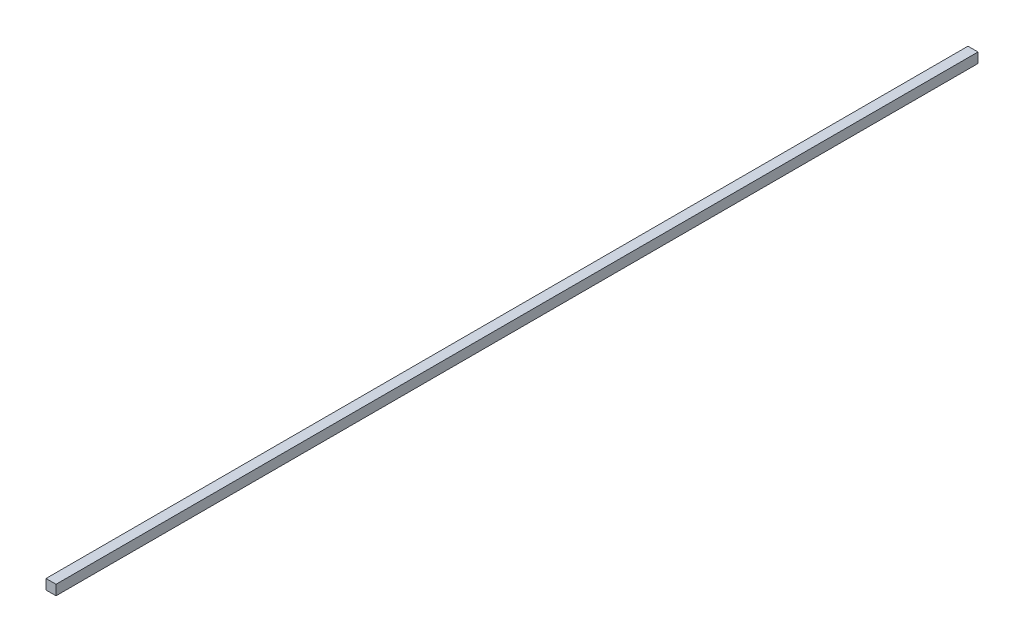
ISO-10303-21;
HEADER;
FILE_DESCRIPTION(('STEP AP214'),'2;1');
FILE_NAME('part.step','',(''),(''),'','','');
FILE_SCHEMA(('AUTOMOTIVE_DESIGN { 1 0 10303 214 1 1 1 1 }'));
ENDSEC;
DATA;
#1=APPLICATION_CONTEXT('core data for automotive mechanical design processes');
#2=APPLICATION_PROTOCOL_DEFINITION('international standard','automotive_design',2000,#1);
#3=PRODUCT_CONTEXT('',#1,'mechanical');
#4=PRODUCT('Part','Part','',(#3));
#5=PRODUCT_RELATED_PRODUCT_CATEGORY('part','',(#4));
#6=PRODUCT_DEFINITION_FORMATION('','',#4);
#7=PRODUCT_DEFINITION_CONTEXT('part definition',#1,'design');
#8=PRODUCT_DEFINITION('design','',#6,#7);
#9=PRODUCT_DEFINITION_SHAPE('','',#8);
#10=(LENGTH_UNIT() NAMED_UNIT(*) SI_UNIT(.MILLI.,.METRE.));
#11=(NAMED_UNIT(*) PLANE_ANGLE_UNIT() SI_UNIT($,.RADIAN.));
#12=(NAMED_UNIT(*) SI_UNIT($,.STERADIAN.) SOLID_ANGLE_UNIT());
#13=UNCERTAINTY_MEASURE_WITH_UNIT(LENGTH_MEASURE(1.E-05),#10,'distance_accuracy_value','');
#14=(GEOMETRIC_REPRESENTATION_CONTEXT(3) GLOBAL_UNCERTAINTY_ASSIGNED_CONTEXT((#13)) GLOBAL_UNIT_ASSIGNED_CONTEXT((#10,
#11,#12)) REPRESENTATION_CONTEXT('',''));
#15=CARTESIAN_POINT('',(0.,0.,0.));
#16=DIRECTION('',(0.,0.,1.));
#17=DIRECTION('',(1.,0.,0.));
#18=AXIS2_PLACEMENT_3D('',#15,#16,#17);
#19=CARTESIAN_POINT('',(12.7,12.7,-2336.8));
#20=DIRECTION('',(1.,0.,0.));
#21=DIRECTION('',(0.,1.,0.));
#22=AXIS2_PLACEMENT_3D('',#19,#20,#21);
#23=PLANE('',#22);
#24=DIRECTION('',(0.,1.,0.));
#25=VECTOR('',#24,1.);
#26=CARTESIAN_POINT('',(12.7,12.7,0.));
#27=LINE('',#26,#25);
#28=CARTESIAN_POINT('',(12.7,-12.7,0.));
#29=VERTEX_POINT('',#28);
#30=CARTESIAN_POINT('',(12.7,12.7,0.));
#31=VERTEX_POINT('',#30);
#32=EDGE_CURVE('E107',#29,#31,#27,.T.);
#33=ORIENTED_EDGE('',*,*,#32,.F.);
#34=DIRECTION('',(0.,0.,1.));
#35=VECTOR('',#34,1.);
#36=CARTESIAN_POINT('',(12.7,-12.7,-2336.8));
#37=LINE('',#36,#35);
#38=CARTESIAN_POINT('',(12.7,-12.7,-2336.8));
#39=VERTEX_POINT('',#38);
#40=EDGE_CURVE('E11',#39,#29,#37,.T.);
#41=ORIENTED_EDGE('',*,*,#40,.F.);
#42=DIRECTION('',(0.,1.,0.));
#43=VECTOR('',#42,1.);
#44=CARTESIAN_POINT('',(12.7,12.7,-2336.8));
#45=LINE('',#44,#43);
#46=CARTESIAN_POINT('',(12.7,12.7,-2336.8));
#47=VERTEX_POINT('',#46);
#48=EDGE_CURVE('E101',#39,#47,#45,.T.);
#49=ORIENTED_EDGE('',*,*,#48,.T.);
#50=DIRECTION('',(0.,0.,1.));
#51=VECTOR('',#50,1.);
#52=CARTESIAN_POINT('',(12.7,12.7,-2336.8));
#53=LINE('',#52,#51);
#54=EDGE_CURVE('E46',#47,#31,#53,.T.);
#55=ORIENTED_EDGE('',*,*,#54,.T.);
#56=EDGE_LOOP('',(#33,#41,#49,#55));
#57=FACE_BOUND('',#56,.T.);
#58=ADVANCED_FACE('F43',(#57),#23,.T.);
#59=CARTESIAN_POINT('',(-12.7,-12.7,-2336.8));
#60=DIRECTION('',(0.,-1.,0.));
#61=DIRECTION('',(0.,0.,-1.));
#62=AXIS2_PLACEMENT_3D('',#59,#60,#61);
#63=PLANE('',#62);
#64=DIRECTION('',(1.,0.,0.));
#65=VECTOR('',#64,1.);
#66=CARTESIAN_POINT('',(-12.7,-12.7,0.));
#67=LINE('',#66,#65);
#68=CARTESIAN_POINT('',(-12.7,-12.7,0.));
#69=VERTEX_POINT('',#68);
#70=EDGE_CURVE('E103',#69,#29,#67,.T.);
#71=ORIENTED_EDGE('',*,*,#70,.F.);
#72=DIRECTION('',(0.,0.,1.));
#73=VECTOR('',#72,1.);
#74=CARTESIAN_POINT('',(-12.7,-12.7,-2336.8));
#75=LINE('',#74,#73);
#76=CARTESIAN_POINT('',(-12.7,-12.7,-2336.8));
#77=VERTEX_POINT('',#76);
#78=EDGE_CURVE('E52',#77,#69,#75,.T.);
#79=ORIENTED_EDGE('',*,*,#78,.F.);
#80=DIRECTION('',(1.,0.,0.));
#81=VECTOR('',#80,1.);
#82=CARTESIAN_POINT('',(-12.7,-12.7,-2336.8));
#83=LINE('',#82,#81);
#84=EDGE_CURVE('E98',#77,#39,#83,.T.);
#85=ORIENTED_EDGE('',*,*,#84,.T.);
#86=ORIENTED_EDGE('',*,*,#40,.T.);
#87=EDGE_LOOP('',(#71,#79,#85,#86));
#88=FACE_BOUND('',#87,.T.);
#89=ADVANCED_FACE('F117',(#88),#63,.T.);
#90=CARTESIAN_POINT('',(-12.7,12.7,-2336.8));
#91=DIRECTION('',(-1.,0.,0.));
#92=DIRECTION('',(0.,-1.,0.));
#93=AXIS2_PLACEMENT_3D('',#90,#91,#92);
#94=PLANE('',#93);
#95=DIRECTION('',(0.,-1.,0.));
#96=VECTOR('',#95,1.);
#97=CARTESIAN_POINT('',(-12.7,12.7,0.));
#98=LINE('',#97,#96);
#99=CARTESIAN_POINT('',(-12.7,12.7,0.));
#100=VERTEX_POINT('',#99);
#101=EDGE_CURVE('E93',#100,#69,#98,.T.);
#102=ORIENTED_EDGE('',*,*,#101,.F.);
#103=DIRECTION('',(0.,0.,1.));
#104=VECTOR('',#103,1.);
#105=CARTESIAN_POINT('',(-12.7,12.7,-2336.8));
#106=LINE('',#105,#104);
#107=CARTESIAN_POINT('',(-12.7,12.7,-2336.8));
#108=VERTEX_POINT('',#107);
#109=EDGE_CURVE('E88',#108,#100,#106,.T.);
#110=ORIENTED_EDGE('',*,*,#109,.F.);
#111=DIRECTION('',(0.,-1.,0.));
#112=VECTOR('',#111,1.);
#113=CARTESIAN_POINT('',(-12.7,12.7,-2336.8));
#114=LINE('',#113,#112);
#115=EDGE_CURVE('E91',#108,#77,#114,.T.);
#116=ORIENTED_EDGE('',*,*,#115,.T.);
#117=ORIENTED_EDGE('',*,*,#78,.T.);
#118=EDGE_LOOP('',(#102,#110,#116,#117));
#119=FACE_BOUND('',#118,.T.);
#120=ADVANCED_FACE('F90',(#119),#94,.T.);
#121=CARTESIAN_POINT('',(-12.7,12.7,-2336.8));
#122=DIRECTION('',(0.,1.,0.));
#123=DIRECTION('',(0.,0.,1.));
#124=AXIS2_PLACEMENT_3D('',#121,#122,#123);
#125=PLANE('',#124);
#126=DIRECTION('',(-1.,0.,0.));
#127=VECTOR('',#126,1.);
#128=CARTESIAN_POINT('',(-12.7,12.7,0.));
#129=LINE('',#128,#127);
#130=EDGE_CURVE('E110',#31,#100,#129,.T.);
#131=ORIENTED_EDGE('',*,*,#130,.F.);
#132=ORIENTED_EDGE('',*,*,#54,.F.);
#133=DIRECTION('',(-1.,0.,0.));
#134=VECTOR('',#133,1.);
#135=CARTESIAN_POINT('',(-12.7,12.7,-2336.8));
#136=LINE('',#135,#134);
#137=EDGE_CURVE('E97',#47,#108,#136,.T.);
#138=ORIENTED_EDGE('',*,*,#137,.T.);
#139=ORIENTED_EDGE('',*,*,#109,.T.);
#140=EDGE_LOOP('',(#131,#132,#138,#139));
#141=FACE_BOUND('',#140,.T.);
#142=ADVANCED_FACE('F100',(#141),#125,.T.);
#143=CARTESIAN_POINT('',(0.,0.,-2336.8));
#144=DIRECTION('',(0.,0.,1.));
#145=DIRECTION('',(1.,0.,0.));
#146=AXIS2_PLACEMENT_3D('',#143,#144,#145);
#147=PLANE('',#146);
#148=ORIENTED_EDGE('',*,*,#48,.F.);
#149=ORIENTED_EDGE('',*,*,#84,.F.);
#150=ORIENTED_EDGE('',*,*,#115,.F.);
#151=ORIENTED_EDGE('',*,*,#137,.F.);
#152=EDGE_LOOP('',(#148,#149,#150,#151));
#153=FACE_BOUND('',#152,.T.);
#154=ADVANCED_FACE('F96',(#153),#147,.F.);
#155=CARTESIAN_POINT('',(0.,0.,0.));
#156=DIRECTION('',(0.,0.,1.));
#157=DIRECTION('',(1.,0.,0.));
#158=AXIS2_PLACEMENT_3D('',#155,#156,#157);
#159=PLANE('',#158);
#160=ORIENTED_EDGE('',*,*,#32,.T.);
#161=ORIENTED_EDGE('',*,*,#130,.T.);
#162=ORIENTED_EDGE('',*,*,#101,.T.);
#163=ORIENTED_EDGE('',*,*,#70,.T.);
#164=EDGE_LOOP('',(#160,#161,#162,#163));
#165=FACE_BOUND('',#164,.T.);
#166=ADVANCED_FACE('F116',(#165),#159,.T.);
#167=CLOSED_SHELL('',(#58,#89,#120,#142,#154,#166));
#168=MANIFOLD_SOLID_BREP('B2',#167);
#169=ADVANCED_BREP_SHAPE_REPRESENTATION('',(#18,#168),#14);
#170=SHAPE_DEFINITION_REPRESENTATION(#9,#169);
ENDSEC;
END-ISO-10303-21;
